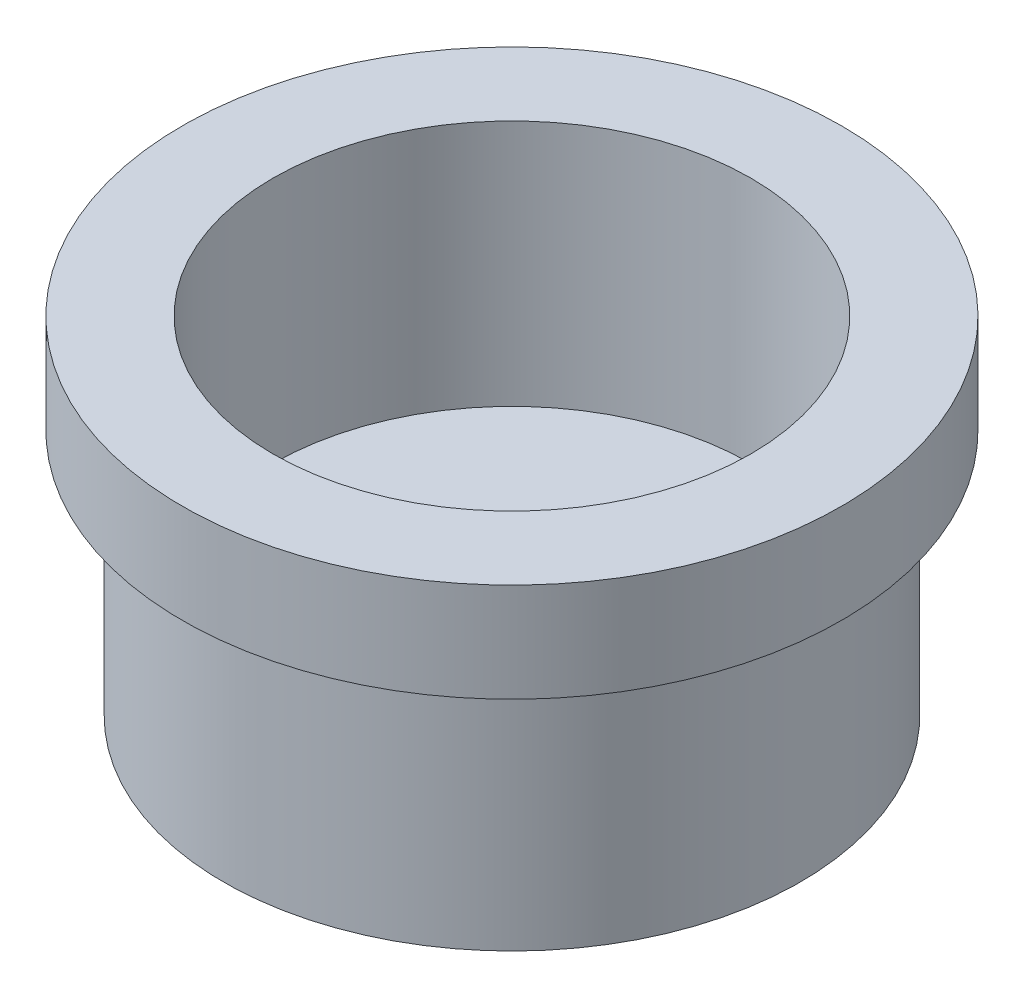
ISO-10303-21;
HEADER;
FILE_DESCRIPTION(('STEP AP214'),'2;1');
FILE_NAME('part.step','',(''),(''),'','','');
FILE_SCHEMA(('AUTOMOTIVE_DESIGN { 1 0 10303 214 1 1 1 1 }'));
ENDSEC;
DATA;
#1=APPLICATION_CONTEXT('core data for automotive mechanical design processes');
#2=APPLICATION_PROTOCOL_DEFINITION('international standard','automotive_design',2000,#1);
#3=PRODUCT_CONTEXT('',#1,'mechanical');
#4=PRODUCT('Part','Part','',(#3));
#5=PRODUCT_RELATED_PRODUCT_CATEGORY('part','',(#4));
#6=PRODUCT_DEFINITION_FORMATION('','',#4);
#7=PRODUCT_DEFINITION_CONTEXT('part definition',#1,'design');
#8=PRODUCT_DEFINITION('design','',#6,#7);
#9=PRODUCT_DEFINITION_SHAPE('','',#8);
#10=(LENGTH_UNIT() NAMED_UNIT(*) SI_UNIT(.MILLI.,.METRE.));
#11=(NAMED_UNIT(*) PLANE_ANGLE_UNIT() SI_UNIT($,.RADIAN.));
#12=(NAMED_UNIT(*) SI_UNIT($,.STERADIAN.) SOLID_ANGLE_UNIT());
#13=UNCERTAINTY_MEASURE_WITH_UNIT(LENGTH_MEASURE(1.E-05),#10,'distance_accuracy_value','');
#14=(GEOMETRIC_REPRESENTATION_CONTEXT(3) GLOBAL_UNCERTAINTY_ASSIGNED_CONTEXT((#13)) GLOBAL_UNIT_ASSIGNED_CONTEXT((#10,
#11,#12)) REPRESENTATION_CONTEXT('',''));
#15=CARTESIAN_POINT('',(0.,0.,0.));
#16=DIRECTION('',(0.,0.,1.));
#17=DIRECTION('',(1.,0.,0.));
#18=AXIS2_PLACEMENT_3D('',#15,#16,#17);
#19=CARTESIAN_POINT('',(-4.5,0.,0.));
#20=DIRECTION('',(0.,1.,0.));
#21=DIRECTION('',(0.,0.,1.));
#22=AXIS2_PLACEMENT_3D('',#19,#20,#21);
#23=PLANE('',#22);
#24=CARTESIAN_POINT('',(0.,0.,0.));
#25=DIRECTION('',(0.,-1.,0.));
#26=DIRECTION('',(0.,0.,-1.));
#27=AXIS2_PLACEMENT_3D('',#24,#25,#26);
#28=CIRCLE('',#27,2.5);
#29=CARTESIAN_POINT('',(0.,0.,-2.5));
#30=VERTEX_POINT('',#29);
#31=EDGE_CURVE('E10',#30,#30,#28,.T.);
#32=ORIENTED_EDGE('',*,*,#31,.F.);
#33=EDGE_LOOP('',(#32));
#34=FACE_BOUND('',#33,.T.);
#35=CARTESIAN_POINT('',(0.,0.,0.));
#36=DIRECTION('',(0.,-1.,0.));
#37=DIRECTION('',(0.,0.,-1.));
#38=AXIS2_PLACEMENT_3D('',#35,#36,#37);
#39=CIRCLE('',#38,4.5);
#40=CARTESIAN_POINT('',(0.,0.,-4.5));
#41=VERTEX_POINT('',#40);
#42=EDGE_CURVE('E83',#41,#41,#39,.T.);
#43=ORIENTED_EDGE('',*,*,#42,.T.);
#44=EDGE_LOOP('',(#43));
#45=FACE_BOUND('',#44,.T.);
#46=ADVANCED_FACE('F37',(#34,#45),#23,.F.);
#47=CARTESIAN_POINT('',(0.,0.,0.));
#48=DIRECTION('',(0.,-1.,0.));
#49=DIRECTION('',(0.,0.,-1.));
#50=AXIS2_PLACEMENT_3D('',#47,#48,#49);
#51=CYLINDRICAL_SURFACE('',#50,2.5);
#52=CARTESIAN_POINT('',(0.,9.,0.));
#53=DIRECTION('',(0.,-1.,0.));
#54=DIRECTION('',(0.,0.,-1.));
#55=AXIS2_PLACEMENT_3D('',#52,#53,#54);
#56=CIRCLE('',#55,2.5);
#57=CARTESIAN_POINT('',(0.,9.,-2.5));
#58=VERTEX_POINT('',#57);
#59=EDGE_CURVE('E43',#58,#58,#56,.T.);
#60=ORIENTED_EDGE('',*,*,#59,.F.);
#61=EDGE_LOOP('',(#60));
#62=FACE_BOUND('',#61,.T.);
#63=ORIENTED_EDGE('',*,*,#31,.T.);
#64=EDGE_LOOP('',(#63));
#65=FACE_BOUND('',#64,.T.);
#66=ADVANCED_FACE('F156',(#62,#65),#51,.F.);
#67=CARTESIAN_POINT('',(-2.5,9.,0.));
#68=DIRECTION('',(0.,-1.,0.));
#69=DIRECTION('',(0.,0.,-1.));
#70=AXIS2_PLACEMENT_3D('',#67,#68,#69);
#71=PLANE('',#70);
#72=CARTESIAN_POINT('',(0.,9.,0.));
#73=DIRECTION('',(0.,-1.,0.));
#74=DIRECTION('',(0.,0.,-1.));
#75=AXIS2_PLACEMENT_3D('',#72,#73,#74);
#76=CIRCLE('',#75,4.75);
#77=CARTESIAN_POINT('',(0.,9.,-4.75));
#78=VERTEX_POINT('',#77);
#79=EDGE_CURVE('E47',#78,#78,#76,.T.);
#80=ORIENTED_EDGE('',*,*,#79,.F.);
#81=EDGE_LOOP('',(#80));
#82=FACE_BOUND('',#81,.T.);
#83=ORIENTED_EDGE('',*,*,#59,.T.);
#84=EDGE_LOOP('',(#83));
#85=FACE_BOUND('',#84,.T.);
#86=ADVANCED_FACE('F151',(#82,#85),#71,.F.);
#87=CARTESIAN_POINT('',(0.,0.,0.));
#88=DIRECTION('',(0.,-1.,0.));
#89=DIRECTION('',(0.,0.,-1.));
#90=AXIS2_PLACEMENT_3D('',#87,#88,#89);
#91=CYLINDRICAL_SURFACE('',#90,4.75);
#92=CARTESIAN_POINT('',(0.,13.,0.));
#93=DIRECTION('',(0.,-1.,0.));
#94=DIRECTION('',(0.,0.,-1.));
#95=AXIS2_PLACEMENT_3D('',#92,#93,#94);
#96=CIRCLE('',#95,4.75);
#97=CARTESIAN_POINT('',(0.,13.,-4.75));
#98=VERTEX_POINT('',#97);
#99=EDGE_CURVE('E51',#98,#98,#96,.T.);
#100=ORIENTED_EDGE('',*,*,#99,.F.);
#101=EDGE_LOOP('',(#100));
#102=FACE_BOUND('',#101,.T.);
#103=ORIENTED_EDGE('',*,*,#79,.T.);
#104=EDGE_LOOP('',(#103));
#105=FACE_BOUND('',#104,.T.);
#106=ADVANCED_FACE('F145',(#102,#105),#91,.F.);
#107=CARTESIAN_POINT('',(-4.75,13.,0.));
#108=DIRECTION('',(0.,-1.,0.));
#109=DIRECTION('',(0.,0.,-1.));
#110=AXIS2_PLACEMENT_3D('',#107,#108,#109);
#111=PLANE('',#110);
#112=CARTESIAN_POINT('',(0.,13.,0.));
#113=DIRECTION('',(0.,-1.,0.));
#114=DIRECTION('',(0.,0.,-1.));
#115=AXIS2_PLACEMENT_3D('',#112,#113,#114);
#116=CIRCLE('',#115,14.5);
#117=CARTESIAN_POINT('',(0.,13.,-14.5));
#118=VERTEX_POINT('',#117);
#119=EDGE_CURVE('E56',#118,#118,#116,.T.);
#120=ORIENTED_EDGE('',*,*,#119,.F.);
#121=EDGE_LOOP('',(#120));
#122=FACE_BOUND('',#121,.T.);
#123=ORIENTED_EDGE('',*,*,#99,.T.);
#124=EDGE_LOOP('',(#123));
#125=FACE_BOUND('',#124,.T.);
#126=ADVANCED_FACE('F139',(#122,#125),#111,.F.);
#127=CARTESIAN_POINT('',(0.,0.,0.));
#128=DIRECTION('',(0.,-1.,0.));
#129=DIRECTION('',(0.,0.,-1.));
#130=AXIS2_PLACEMENT_3D('',#127,#128,#129);
#131=CYLINDRICAL_SURFACE('',#130,14.5);
#132=CARTESIAN_POINT('',(0.,28.,0.));
#133=DIRECTION('',(0.,-1.,0.));
#134=DIRECTION('',(0.,0.,-1.));
#135=AXIS2_PLACEMENT_3D('',#132,#133,#134);
#136=CIRCLE('',#135,14.5);
#137=CARTESIAN_POINT('',(0.,28.,-14.5));
#138=VERTEX_POINT('',#137);
#139=EDGE_CURVE('E59',#138,#138,#136,.T.);
#140=ORIENTED_EDGE('',*,*,#139,.F.);
#141=EDGE_LOOP('',(#140));
#142=FACE_BOUND('',#141,.T.);
#143=ORIENTED_EDGE('',*,*,#119,.T.);
#144=EDGE_LOOP('',(#143));
#145=FACE_BOUND('',#144,.T.);
#146=ADVANCED_FACE('F133',(#142,#145),#131,.F.);
#147=CARTESIAN_POINT('',(-14.5,28.,0.));
#148=DIRECTION('',(0.,-1.,0.));
#149=DIRECTION('',(0.,0.,-1.));
#150=AXIS2_PLACEMENT_3D('',#147,#148,#149);
#151=PLANE('',#150);
#152=CARTESIAN_POINT('',(0.,28.,0.));
#153=DIRECTION('',(0.,-1.,0.));
#154=DIRECTION('',(0.,0.,-1.));
#155=AXIS2_PLACEMENT_3D('',#152,#153,#154);
#156=CIRCLE('',#155,20.);
#157=CARTESIAN_POINT('',(0.,28.,-20.));
#158=VERTEX_POINT('',#157);
#159=EDGE_CURVE('E62',#158,#158,#156,.T.);
#160=ORIENTED_EDGE('',*,*,#159,.F.);
#161=EDGE_LOOP('',(#160));
#162=FACE_BOUND('',#161,.T.);
#163=ORIENTED_EDGE('',*,*,#139,.T.);
#164=EDGE_LOOP('',(#163));
#165=FACE_BOUND('',#164,.T.);
#166=ADVANCED_FACE('F127',(#162,#165),#151,.F.);
#167=CARTESIAN_POINT('',(0.,0.,0.));
#168=DIRECTION('',(0.,-1.,0.));
#169=DIRECTION('',(0.,0.,-1.));
#170=AXIS2_PLACEMENT_3D('',#167,#168,#169);
#171=CYLINDRICAL_SURFACE('',#170,20.);
#172=CARTESIAN_POINT('',(0.,22.,0.));
#173=DIRECTION('',(0.,-1.,0.));
#174=DIRECTION('',(0.,0.,-1.));
#175=AXIS2_PLACEMENT_3D('',#172,#173,#174);
#176=CIRCLE('',#175,20.);
#177=CARTESIAN_POINT('',(0.,22.,-20.));
#178=VERTEX_POINT('',#177);
#179=EDGE_CURVE('E65',#178,#178,#176,.T.);
#180=ORIENTED_EDGE('',*,*,#179,.F.);
#181=EDGE_LOOP('',(#180));
#182=FACE_BOUND('',#181,.T.);
#183=ORIENTED_EDGE('',*,*,#159,.T.);
#184=EDGE_LOOP('',(#183));
#185=FACE_BOUND('',#184,.T.);
#186=ADVANCED_FACE('F121',(#182,#185),#171,.T.);
#187=CARTESIAN_POINT('',(-20.,22.,0.));
#188=DIRECTION('',(0.,1.,0.));
#189=DIRECTION('',(0.,0.,1.));
#190=AXIS2_PLACEMENT_3D('',#187,#188,#189);
#191=PLANE('',#190);
#192=CARTESIAN_POINT('',(0.,22.,0.));
#193=DIRECTION('',(0.,-1.,0.));
#194=DIRECTION('',(0.,0.,-1.));
#195=AXIS2_PLACEMENT_3D('',#192,#193,#194);
#196=CIRCLE('',#195,17.5);
#197=CARTESIAN_POINT('',(0.,22.,-17.5));
#198=VERTEX_POINT('',#197);
#199=EDGE_CURVE('E68',#198,#198,#196,.T.);
#200=ORIENTED_EDGE('',*,*,#199,.F.);
#201=EDGE_LOOP('',(#200));
#202=FACE_BOUND('',#201,.T.);
#203=ORIENTED_EDGE('',*,*,#179,.T.);
#204=EDGE_LOOP('',(#203));
#205=FACE_BOUND('',#204,.T.);
#206=ADVANCED_FACE('F115',(#202,#205),#191,.F.);
#207=CARTESIAN_POINT('',(0.,0.,0.));
#208=DIRECTION('',(0.,-1.,0.));
#209=DIRECTION('',(0.,0.,-1.));
#210=AXIS2_PLACEMENT_3D('',#207,#208,#209);
#211=CYLINDRICAL_SURFACE('',#210,17.5);
#212=CARTESIAN_POINT('',(0.,7.,0.));
#213=DIRECTION('',(0.,-1.,0.));
#214=DIRECTION('',(0.,0.,-1.));
#215=AXIS2_PLACEMENT_3D('',#212,#213,#214);
#216=CIRCLE('',#215,17.5);
#217=CARTESIAN_POINT('',(0.,7.,-17.5));
#218=VERTEX_POINT('',#217);
#219=EDGE_CURVE('E71',#218,#218,#216,.T.);
#220=ORIENTED_EDGE('',*,*,#219,.F.);
#221=EDGE_LOOP('',(#220));
#222=FACE_BOUND('',#221,.T.);
#223=ORIENTED_EDGE('',*,*,#199,.T.);
#224=EDGE_LOOP('',(#223));
#225=FACE_BOUND('',#224,.T.);
#226=ADVANCED_FACE('F109',(#222,#225),#211,.T.);
#227=CARTESIAN_POINT('',(-17.5,7.,0.));
#228=DIRECTION('',(0.,1.,0.));
#229=DIRECTION('',(0.,0.,1.));
#230=AXIS2_PLACEMENT_3D('',#227,#228,#229);
#231=PLANE('',#230);
#232=CARTESIAN_POINT('',(0.,7.,0.));
#233=DIRECTION('',(0.,-1.,0.));
#234=DIRECTION('',(0.,0.,-1.));
#235=AXIS2_PLACEMENT_3D('',#232,#233,#234);
#236=CIRCLE('',#235,6.5);
#237=CARTESIAN_POINT('',(0.,7.,-6.5));
#238=VERTEX_POINT('',#237);
#239=EDGE_CURVE('E74',#238,#238,#236,.T.);
#240=ORIENTED_EDGE('',*,*,#239,.F.);
#241=EDGE_LOOP('',(#240));
#242=FACE_BOUND('',#241,.T.);
#243=ORIENTED_EDGE('',*,*,#219,.T.);
#244=EDGE_LOOP('',(#243));
#245=FACE_BOUND('',#244,.T.);
#246=ADVANCED_FACE('F103',(#242,#245),#231,.F.);
#247=CARTESIAN_POINT('',(0.,0.,0.));
#248=DIRECTION('',(0.,-1.,0.));
#249=DIRECTION('',(0.,0.,-1.));
#250=AXIS2_PLACEMENT_3D('',#247,#248,#249);
#251=CYLINDRICAL_SURFACE('',#250,6.5);
#252=CARTESIAN_POINT('',(0.,6.,0.));
#253=DIRECTION('',(0.,-1.,0.));
#254=DIRECTION('',(0.,0.,-1.));
#255=AXIS2_PLACEMENT_3D('',#252,#253,#254);
#256=CIRCLE('',#255,6.5);
#257=CARTESIAN_POINT('',(0.,6.,-6.5));
#258=VERTEX_POINT('',#257);
#259=EDGE_CURVE('E77',#258,#258,#256,.T.);
#260=ORIENTED_EDGE('',*,*,#259,.F.);
#261=EDGE_LOOP('',(#260));
#262=FACE_BOUND('',#261,.T.);
#263=ORIENTED_EDGE('',*,*,#239,.T.);
#264=EDGE_LOOP('',(#263));
#265=FACE_BOUND('',#264,.T.);
#266=ADVANCED_FACE('F97',(#262,#265),#251,.T.);
#267=CARTESIAN_POINT('',(-6.5,6.,0.));
#268=DIRECTION('',(0.,1.,0.));
#269=DIRECTION('',(0.,0.,1.));
#270=AXIS2_PLACEMENT_3D('',#267,#268,#269);
#271=PLANE('',#270);
#272=CARTESIAN_POINT('',(0.,6.,0.));
#273=DIRECTION('',(0.,-1.,0.));
#274=DIRECTION('',(0.,0.,-1.));
#275=AXIS2_PLACEMENT_3D('',#272,#273,#274);
#276=CIRCLE('',#275,4.5);
#277=CARTESIAN_POINT('',(0.,6.,-4.5));
#278=VERTEX_POINT('',#277);
#279=EDGE_CURVE('E80',#278,#278,#276,.T.);
#280=ORIENTED_EDGE('',*,*,#279,.F.);
#281=EDGE_LOOP('',(#280));
#282=FACE_BOUND('',#281,.T.);
#283=ORIENTED_EDGE('',*,*,#259,.T.);
#284=EDGE_LOOP('',(#283));
#285=FACE_BOUND('',#284,.T.);
#286=ADVANCED_FACE('F91',(#282,#285),#271,.F.);
#287=CARTESIAN_POINT('',(0.,0.,0.));
#288=DIRECTION('',(0.,-1.,0.));
#289=DIRECTION('',(0.,0.,-1.));
#290=AXIS2_PLACEMENT_3D('',#287,#288,#289);
#291=CYLINDRICAL_SURFACE('',#290,4.5);
#292=ORIENTED_EDGE('',*,*,#42,.F.);
#293=EDGE_LOOP('',(#292));
#294=FACE_BOUND('',#293,.T.);
#295=ORIENTED_EDGE('',*,*,#279,.T.);
#296=EDGE_LOOP('',(#295));
#297=FACE_BOUND('',#296,.T.);
#298=ADVANCED_FACE('F88',(#294,#297),#291,.T.);
#299=CLOSED_SHELL('',(#46,#66,#86,#106,#126,#146,#166,#186,#206,#226,#246,#266,#286,#298));
#300=MANIFOLD_SOLID_BREP('B2',#299);
#301=ADVANCED_BREP_SHAPE_REPRESENTATION('',(#18,#300),#14);
#302=SHAPE_DEFINITION_REPRESENTATION(#9,#301);
ENDSEC;
END-ISO-10303-21;
